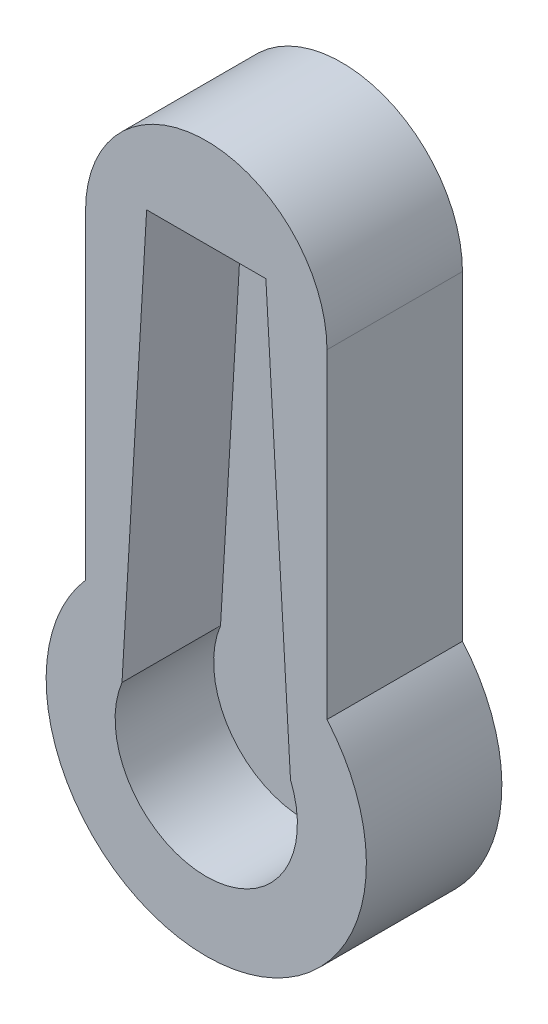
ISO-10303-21;
HEADER;
FILE_DESCRIPTION(('STEP AP214'),'2;1');
FILE_NAME('part.step','',(''),(''),'','','');
FILE_SCHEMA(('AUTOMOTIVE_DESIGN { 1 0 10303 214 1 1 1 1 }'));
ENDSEC;
DATA;
#1=APPLICATION_CONTEXT('core data for automotive mechanical design processes');
#2=APPLICATION_PROTOCOL_DEFINITION('international standard','automotive_design',2000,#1);
#3=PRODUCT_CONTEXT('',#1,'mechanical');
#4=PRODUCT('Part','Part','',(#3));
#5=PRODUCT_RELATED_PRODUCT_CATEGORY('part','',(#4));
#6=PRODUCT_DEFINITION_FORMATION('','',#4);
#7=PRODUCT_DEFINITION_CONTEXT('part definition',#1,'design');
#8=PRODUCT_DEFINITION('design','',#6,#7);
#9=PRODUCT_DEFINITION_SHAPE('','',#8);
#10=(LENGTH_UNIT() NAMED_UNIT(*) SI_UNIT(.MILLI.,.METRE.));
#11=(NAMED_UNIT(*) PLANE_ANGLE_UNIT() SI_UNIT($,.RADIAN.));
#12=(NAMED_UNIT(*) SI_UNIT($,.STERADIAN.) SOLID_ANGLE_UNIT());
#13=UNCERTAINTY_MEASURE_WITH_UNIT(LENGTH_MEASURE(1.E-05),#10,'distance_accuracy_value','');
#14=(GEOMETRIC_REPRESENTATION_CONTEXT(3) GLOBAL_UNCERTAINTY_ASSIGNED_CONTEXT((#13)) GLOBAL_UNIT_ASSIGNED_CONTEXT((#10,
#11,#12)) REPRESENTATION_CONTEXT('',''));
#15=CARTESIAN_POINT('',(0.,0.,0.));
#16=DIRECTION('',(0.,0.,1.));
#17=DIRECTION('',(1.,0.,0.));
#18=AXIS2_PLACEMENT_3D('',#15,#16,#17);
#19=CARTESIAN_POINT('',(0.,0.,4.));
#20=DIRECTION('',(0.,0.,1.));
#21=DIRECTION('',(1.,0.,0.));
#22=AXIS2_PLACEMENT_3D('',#19,#20,#21);
#23=PLANE('',#22);
#24=CARTESIAN_POINT('',(0.,0.,4.));
#25=DIRECTION('',(0.,0.,1.));
#26=DIRECTION('',(1.,0.,0.));
#27=AXIS2_PLACEMENT_3D('',#24,#25,#26);
#28=CIRCLE('',#27,6.5);
#29=CARTESIAN_POINT('',(-4.9,4.27083130081252,4.));
#30=VERTEX_POINT('',#29);
#31=CARTESIAN_POINT('',(4.9,4.27083130081252,4.));
#32=VERTEX_POINT('',#31);
#33=EDGE_CURVE('E116',#30,#32,#28,.T.);
#34=ORIENTED_EDGE('',*,*,#33,.T.);
#35=DIRECTION('',(0.,1.,0.));
#36=VECTOR('',#35,1.);
#37=CARTESIAN_POINT('',(4.9,4.27083130081252,4.));
#38=LINE('',#37,#36);
#39=CARTESIAN_POINT('',(4.9,17.2708313008125,4.));
#40=VERTEX_POINT('',#39);
#41=EDGE_CURVE('E184',#32,#40,#38,.T.);
#42=ORIENTED_EDGE('',*,*,#41,.T.);
#43=CARTESIAN_POINT('',(0.,17.2708313008125,4.));
#44=DIRECTION('',(0.,0.,1.));
#45=DIRECTION('',(-1.,0.,0.));
#46=AXIS2_PLACEMENT_3D('',#43,#44,#45);
#47=CIRCLE('',#46,4.9);
#48=CARTESIAN_POINT('',(-4.9,17.2708313008125,4.));
#49=VERTEX_POINT('',#48);
#50=EDGE_CURVE('E187',#40,#49,#47,.T.);
#51=ORIENTED_EDGE('',*,*,#50,.T.);
#52=DIRECTION('',(0.,-1.,0.));
#53=VECTOR('',#52,1.);
#54=CARTESIAN_POINT('',(-4.9,4.27083130081252,4.));
#55=LINE('',#54,#53);
#56=EDGE_CURVE('E69',#49,#30,#55,.T.);
#57=ORIENTED_EDGE('',*,*,#56,.T.);
#58=EDGE_LOOP('',(#34,#42,#51,#57));
#59=FACE_BOUND('',#58,.T.);
#60=DIRECTION('',(-0.0583184400996109,0.998298031423657,0.));
#61=VECTOR('',#60,1.);
#62=CARTESIAN_POINT('',(2.42,18.53,4.));
#63=LINE('',#62,#61);
#64=CARTESIAN_POINT('',(3.42,1.41194900757783,4.));
#65=VERTEX_POINT('',#64);
#66=CARTESIAN_POINT('',(2.42,18.53,4.));
#67=VERTEX_POINT('',#66);
#68=EDGE_CURVE('E146',#65,#67,#63,.T.);
#69=ORIENTED_EDGE('',*,*,#68,.F.);
#70=CARTESIAN_POINT('',(0.,0.,4.));
#71=DIRECTION('',(0.,0.,1.));
#72=DIRECTION('',(1.,0.,0.));
#73=AXIS2_PLACEMENT_3D('',#70,#71,#72);
#74=CIRCLE('',#73,3.7);
#75=CARTESIAN_POINT('',(-3.42,1.41194900757783,4.));
#76=VERTEX_POINT('',#75);
#77=EDGE_CURVE('E143',#76,#65,#74,.T.);
#78=ORIENTED_EDGE('',*,*,#77,.F.);
#79=DIRECTION('',(-0.0583184400996109,-0.998298031423657,0.));
#80=VECTOR('',#79,1.);
#81=CARTESIAN_POINT('',(-2.42,18.53,4.));
#82=LINE('',#81,#80);
#83=CARTESIAN_POINT('',(-2.42,18.53,4.));
#84=VERTEX_POINT('',#83);
#85=EDGE_CURVE('E153',#84,#76,#82,.T.);
#86=ORIENTED_EDGE('',*,*,#85,.F.);
#87=DIRECTION('',(-1.,0.,0.));
#88=VECTOR('',#87,1.);
#89=CARTESIAN_POINT('',(2.42,18.53,4.));
#90=LINE('',#89,#88);
#91=EDGE_CURVE('E150',#67,#84,#90,.T.);
#92=ORIENTED_EDGE('',*,*,#91,.F.);
#93=EDGE_LOOP('',(#69,#78,#86,#92));
#94=FACE_BOUND('',#93,.T.);
#95=ADVANCED_FACE('F45',(#59,#94),#23,.T.);
#96=CARTESIAN_POINT('',(0.,0.,4.));
#97=DIRECTION('',(0.,0.,-1.));
#98=DIRECTION('',(-1.,0.,0.));
#99=AXIS2_PLACEMENT_3D('',#96,#97,#98);
#100=CYLINDRICAL_SURFACE('',#99,6.5);
#101=DIRECTION('',(0.,0.,-1.));
#102=VECTOR('',#101,1.);
#103=CARTESIAN_POINT('',(-4.9,4.27083130081252,4.));
#104=LINE('',#103,#102);
#105=CARTESIAN_POINT('',(-4.9,4.27083130081252,-1.5));
#106=VERTEX_POINT('',#105);
#107=EDGE_CURVE('E111',#30,#106,#104,.T.);
#108=ORIENTED_EDGE('',*,*,#107,.T.);
#109=CARTESIAN_POINT('',(0.,0.,-1.5));
#110=DIRECTION('',(0.,0.,-1.));
#111=DIRECTION('',(-1.,0.,0.));
#112=AXIS2_PLACEMENT_3D('',#109,#110,#111);
#113=CIRCLE('',#112,6.5);
#114=CARTESIAN_POINT('',(4.9,4.27083130081252,-1.5));
#115=VERTEX_POINT('',#114);
#116=EDGE_CURVE('E115',#115,#106,#113,.T.);
#117=ORIENTED_EDGE('',*,*,#116,.F.);
#118=DIRECTION('',(0.,0.,-1.));
#119=VECTOR('',#118,1.);
#120=CARTESIAN_POINT('',(4.9,4.27083130081252,4.));
#121=LINE('',#120,#119);
#122=EDGE_CURVE('E11',#32,#115,#121,.T.);
#123=ORIENTED_EDGE('',*,*,#122,.F.);
#124=ORIENTED_EDGE('',*,*,#33,.F.);
#125=EDGE_LOOP('',(#108,#117,#123,#124));
#126=FACE_BOUND('',#125,.T.);
#127=ADVANCED_FACE('F47',(#126),#100,.T.);
#128=CARTESIAN_POINT('',(4.9,4.27083130081252,4.));
#129=DIRECTION('',(-1.,0.,0.));
#130=DIRECTION('',(0.,-1.,0.));
#131=AXIS2_PLACEMENT_3D('',#128,#129,#130);
#132=PLANE('',#131);
#133=ORIENTED_EDGE('',*,*,#122,.T.);
#134=DIRECTION('',(0.,-1.,0.));
#135=VECTOR('',#134,1.);
#136=CARTESIAN_POINT('',(4.9,4.27083130081252,-1.5));
#137=LINE('',#136,#135);
#138=CARTESIAN_POINT('',(4.9,17.2708313008125,-1.5));
#139=VERTEX_POINT('',#138);
#140=EDGE_CURVE('E134',#139,#115,#137,.T.);
#141=ORIENTED_EDGE('',*,*,#140,.F.);
#142=DIRECTION('',(0.,0.,-1.));
#143=VECTOR('',#142,1.);
#144=CARTESIAN_POINT('',(4.9,17.2708313008125,4.));
#145=LINE('',#144,#143);
#146=EDGE_CURVE('E54',#40,#139,#145,.T.);
#147=ORIENTED_EDGE('',*,*,#146,.F.);
#148=ORIENTED_EDGE('',*,*,#41,.F.);
#149=EDGE_LOOP('',(#133,#141,#147,#148));
#150=FACE_BOUND('',#149,.T.);
#151=ADVANCED_FACE('F199',(#150),#132,.F.);
#152=CARTESIAN_POINT('',(0.,17.2708313008125,4.));
#153=DIRECTION('',(0.,0.,-1.));
#154=DIRECTION('',(-1.,0.,0.));
#155=AXIS2_PLACEMENT_3D('',#152,#153,#154);
#156=CYLINDRICAL_SURFACE('',#155,4.9);
#157=ORIENTED_EDGE('',*,*,#146,.T.);
#158=CARTESIAN_POINT('',(0.,17.2708313008125,-1.5));
#159=DIRECTION('',(0.,0.,-1.));
#160=DIRECTION('',(1.,0.,0.));
#161=AXIS2_PLACEMENT_3D('',#158,#159,#160);
#162=CIRCLE('',#161,4.9);
#163=CARTESIAN_POINT('',(-4.9,17.2708313008125,-1.5));
#164=VERTEX_POINT('',#163);
#165=EDGE_CURVE('E129',#164,#139,#162,.T.);
#166=ORIENTED_EDGE('',*,*,#165,.F.);
#167=DIRECTION('',(0.,0.,-1.));
#168=VECTOR('',#167,1.);
#169=CARTESIAN_POINT('',(-4.9,17.2708313008125,4.));
#170=LINE('',#169,#168);
#171=EDGE_CURVE('E119',#49,#164,#170,.T.);
#172=ORIENTED_EDGE('',*,*,#171,.F.);
#173=ORIENTED_EDGE('',*,*,#50,.F.);
#174=EDGE_LOOP('',(#157,#166,#172,#173));
#175=FACE_BOUND('',#174,.T.);
#176=ADVANCED_FACE('F197',(#175),#156,.T.);
#177=CARTESIAN_POINT('',(-4.9,4.27083130081252,4.));
#178=DIRECTION('',(1.,0.,0.));
#179=DIRECTION('',(0.,0.,-1.));
#180=AXIS2_PLACEMENT_3D('',#177,#178,#179);
#181=PLANE('',#180);
#182=ORIENTED_EDGE('',*,*,#171,.T.);
#183=DIRECTION('',(0.,1.,0.));
#184=VECTOR('',#183,1.);
#185=CARTESIAN_POINT('',(-4.9,17.2708313008125,-1.5));
#186=LINE('',#185,#184);
#187=EDGE_CURVE('E122',#106,#164,#186,.T.);
#188=ORIENTED_EDGE('',*,*,#187,.F.);
#189=ORIENTED_EDGE('',*,*,#107,.F.);
#190=ORIENTED_EDGE('',*,*,#56,.F.);
#191=EDGE_LOOP('',(#182,#188,#189,#190));
#192=FACE_BOUND('',#191,.T.);
#193=ADVANCED_FACE('F123',(#192),#181,.F.);
#194=CARTESIAN_POINT('',(0.,0.,4.));
#195=DIRECTION('',(0.,0.,-1.));
#196=DIRECTION('',(-1.,0.,0.));
#197=AXIS2_PLACEMENT_3D('',#194,#195,#196);
#198=CYLINDRICAL_SURFACE('',#197,3.7);
#199=CARTESIAN_POINT('',(0.,0.,0.));
#200=DIRECTION('',(0.,0.,1.));
#201=DIRECTION('',(1.,0.,0.));
#202=AXIS2_PLACEMENT_3D('',#199,#200,#201);
#203=CIRCLE('',#202,3.7);
#204=CARTESIAN_POINT('',(-3.42,1.41194900757783,0.));
#205=VERTEX_POINT('',#204);
#206=CARTESIAN_POINT('',(3.42,1.41194900757783,0.));
#207=VERTEX_POINT('',#206);
#208=EDGE_CURVE('E142',#205,#207,#203,.T.);
#209=ORIENTED_EDGE('',*,*,#208,.F.);
#210=DIRECTION('',(0.,0.,-1.));
#211=VECTOR('',#210,1.);
#212=CARTESIAN_POINT('',(-3.42,1.41194900757783,4.));
#213=LINE('',#212,#211);
#214=EDGE_CURVE('E156',#76,#205,#213,.T.);
#215=ORIENTED_EDGE('',*,*,#214,.F.);
#216=ORIENTED_EDGE('',*,*,#77,.T.);
#217=DIRECTION('',(0.,0.,-1.));
#218=VECTOR('',#217,1.);
#219=CARTESIAN_POINT('',(3.42,1.41194900757783,4.));
#220=LINE('',#219,#218);
#221=EDGE_CURVE('E178',#65,#207,#220,.T.);
#222=ORIENTED_EDGE('',*,*,#221,.T.);
#223=EDGE_LOOP('',(#209,#215,#216,#222));
#224=FACE_BOUND('',#223,.T.);
#225=ADVANCED_FACE('F218',(#224),#198,.F.);
#226=CARTESIAN_POINT('',(2.42,18.53,4.));
#227=DIRECTION('',(-0.998298031423657,-0.0583184400996109,0.));
#228=DIRECTION('',(0.0583184400996109,-0.998298031423657,0.));
#229=AXIS2_PLACEMENT_3D('',#226,#227,#228);
#230=PLANE('',#229);
#231=DIRECTION('',(-0.0583184400996109,0.998298031423657,0.));
#232=VECTOR('',#231,1.);
#233=CARTESIAN_POINT('',(2.42,18.53,0.));
#234=LINE('',#233,#232);
#235=CARTESIAN_POINT('',(2.42,18.53,0.));
#236=VERTEX_POINT('',#235);
#237=EDGE_CURVE('E160',#207,#236,#234,.T.);
#238=ORIENTED_EDGE('',*,*,#237,.F.);
#239=ORIENTED_EDGE('',*,*,#221,.F.);
#240=ORIENTED_EDGE('',*,*,#68,.T.);
#241=DIRECTION('',(0.,0.,-1.));
#242=VECTOR('',#241,1.);
#243=CARTESIAN_POINT('',(2.42,18.53,4.));
#244=LINE('',#243,#242);
#245=EDGE_CURVE('E175',#67,#236,#244,.T.);
#246=ORIENTED_EDGE('',*,*,#245,.T.);
#247=EDGE_LOOP('',(#238,#239,#240,#246));
#248=FACE_BOUND('',#247,.T.);
#249=ADVANCED_FACE('F210',(#248),#230,.T.);
#250=CARTESIAN_POINT('',(2.42,18.53,4.));
#251=DIRECTION('',(0.,-1.,0.));
#252=DIRECTION('',(0.,0.,-1.));
#253=AXIS2_PLACEMENT_3D('',#250,#251,#252);
#254=PLANE('',#253);
#255=DIRECTION('',(-1.,0.,0.));
#256=VECTOR('',#255,1.);
#257=CARTESIAN_POINT('',(2.42,18.53,0.));
#258=LINE('',#257,#256);
#259=CARTESIAN_POINT('',(-2.42,18.53,0.));
#260=VERTEX_POINT('',#259);
#261=EDGE_CURVE('E164',#236,#260,#258,.T.);
#262=ORIENTED_EDGE('',*,*,#261,.F.);
#263=ORIENTED_EDGE('',*,*,#245,.F.);
#264=ORIENTED_EDGE('',*,*,#91,.T.);
#265=DIRECTION('',(0.,0.,-1.));
#266=VECTOR('',#265,1.);
#267=CARTESIAN_POINT('',(-2.42,18.53,4.));
#268=LINE('',#267,#266);
#269=EDGE_CURVE('E61',#84,#260,#268,.T.);
#270=ORIENTED_EDGE('',*,*,#269,.T.);
#271=EDGE_LOOP('',(#262,#263,#264,#270));
#272=FACE_BOUND('',#271,.T.);
#273=ADVANCED_FACE('F213',(#272),#254,.T.);
#274=CARTESIAN_POINT('',(-2.42,18.53,4.));
#275=DIRECTION('',(0.998298031423657,-0.0583184400996109,0.));
#276=DIRECTION('',(0.0583184400996109,0.998298031423657,0.));
#277=AXIS2_PLACEMENT_3D('',#274,#275,#276);
#278=PLANE('',#277);
#279=DIRECTION('',(-0.0583184400996109,-0.998298031423657,0.));
#280=VECTOR('',#279,1.);
#281=CARTESIAN_POINT('',(-2.42,18.53,0.));
#282=LINE('',#281,#280);
#283=EDGE_CURVE('E147',#260,#205,#282,.T.);
#284=ORIENTED_EDGE('',*,*,#283,.F.);
#285=ORIENTED_EDGE('',*,*,#269,.F.);
#286=ORIENTED_EDGE('',*,*,#85,.T.);
#287=ORIENTED_EDGE('',*,*,#214,.T.);
#288=EDGE_LOOP('',(#284,#285,#286,#287));
#289=FACE_BOUND('',#288,.T.);
#290=ADVANCED_FACE('F220',(#289),#278,.T.);
#291=CARTESIAN_POINT('',(0.,0.,0.));
#292=DIRECTION('',(0.,0.,-1.));
#293=DIRECTION('',(-1.,0.,0.));
#294=AXIS2_PLACEMENT_3D('',#291,#292,#293);
#295=PLANE('',#294);
#296=ORIENTED_EDGE('',*,*,#283,.T.);
#297=ORIENTED_EDGE('',*,*,#208,.T.);
#298=ORIENTED_EDGE('',*,*,#237,.T.);
#299=ORIENTED_EDGE('',*,*,#261,.T.);
#300=EDGE_LOOP('',(#296,#297,#298,#299));
#301=FACE_BOUND('',#300,.T.);
#302=ADVANCED_FACE('F215',(#301),#295,.F.);
#303=CARTESIAN_POINT('',(0.,0.,-1.5));
#304=DIRECTION('',(0.,0.,-1.));
#305=DIRECTION('',(-1.,0.,0.));
#306=AXIS2_PLACEMENT_3D('',#303,#304,#305);
#307=PLANE('',#306);
#308=ORIENTED_EDGE('',*,*,#116,.T.);
#309=ORIENTED_EDGE('',*,*,#187,.T.);
#310=ORIENTED_EDGE('',*,*,#165,.T.);
#311=ORIENTED_EDGE('',*,*,#140,.T.);
#312=EDGE_LOOP('',(#308,#309,#310,#311));
#313=FACE_BOUND('',#312,.T.);
#314=ADVANCED_FACE('F132',(#313),#307,.T.);
#315=CLOSED_SHELL('',(#95,#127,#151,#176,#193,#225,#249,#273,#290,#302,#314));
#316=MANIFOLD_SOLID_BREP('B2',#315);
#317=ADVANCED_BREP_SHAPE_REPRESENTATION('',(#18,#316),#14);
#318=SHAPE_DEFINITION_REPRESENTATION(#9,#317);
ENDSEC;
END-ISO-10303-21;
